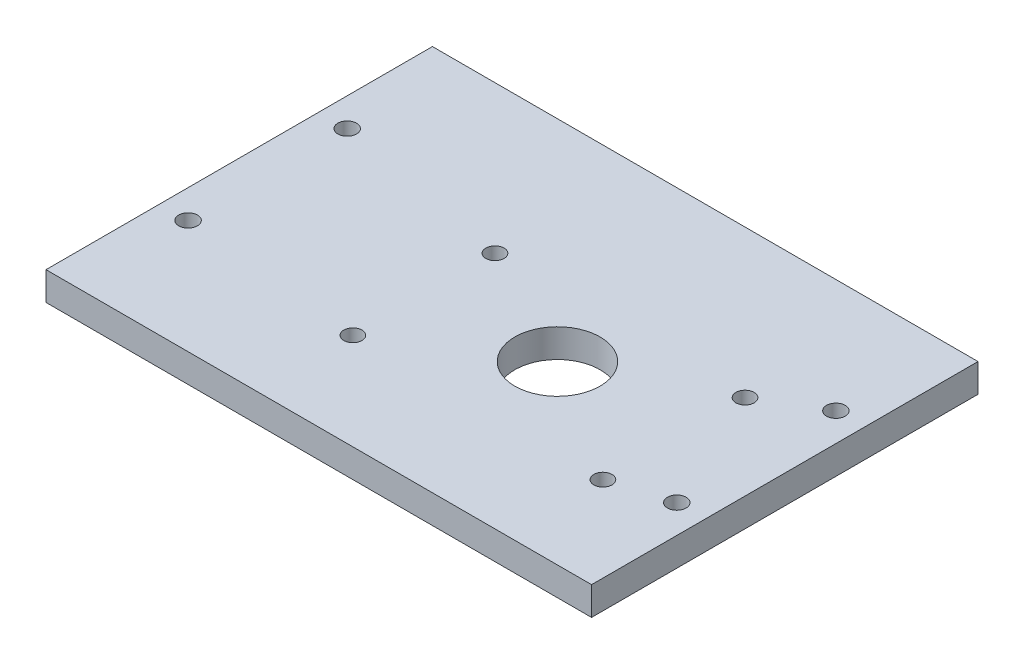
ISO-10303-21;
HEADER;
FILE_DESCRIPTION(('STEP AP214'),'2;1');
FILE_NAME('part.step','',(''),(''),'','','');
FILE_SCHEMA(('AUTOMOTIVE_DESIGN { 1 0 10303 214 1 1 1 1 }'));
ENDSEC;
DATA;
#1=APPLICATION_CONTEXT('core data for automotive mechanical design processes');
#2=APPLICATION_PROTOCOL_DEFINITION('international standard','automotive_design',2000,#1);
#3=PRODUCT_CONTEXT('',#1,'mechanical');
#4=PRODUCT('Part','Part','',(#3));
#5=PRODUCT_RELATED_PRODUCT_CATEGORY('part','',(#4));
#6=PRODUCT_DEFINITION_FORMATION('','',#4);
#7=PRODUCT_DEFINITION_CONTEXT('part definition',#1,'design');
#8=PRODUCT_DEFINITION('design','',#6,#7);
#9=PRODUCT_DEFINITION_SHAPE('','',#8);
#10=(LENGTH_UNIT() NAMED_UNIT(*) SI_UNIT(.MILLI.,.METRE.));
#11=(NAMED_UNIT(*) PLANE_ANGLE_UNIT() SI_UNIT($,.RADIAN.));
#12=(NAMED_UNIT(*) SI_UNIT($,.STERADIAN.) SOLID_ANGLE_UNIT());
#13=UNCERTAINTY_MEASURE_WITH_UNIT(LENGTH_MEASURE(1.E-05),#10,'distance_accuracy_value','');
#14=(GEOMETRIC_REPRESENTATION_CONTEXT(3) GLOBAL_UNCERTAINTY_ASSIGNED_CONTEXT((#13)) GLOBAL_UNIT_ASSIGNED_CONTEXT((#10,
#11,#12)) REPRESENTATION_CONTEXT('',''));
#15=CARTESIAN_POINT('',(0.,0.,0.));
#16=DIRECTION('',(0.,0.,1.));
#17=DIRECTION('',(1.,0.,0.));
#18=AXIS2_PLACEMENT_3D('',#15,#16,#17);
#19=CARTESIAN_POINT('',(-48.,5.,-34.));
#20=DIRECTION('',(1.,0.,0.));
#21=DIRECTION('',(0.,0.,-1.));
#22=AXIS2_PLACEMENT_3D('',#19,#20,#21);
#23=PLANE('',#22);
#24=DIRECTION('',(0.,0.,1.));
#25=VECTOR('',#24,1.);
#26=CARTESIAN_POINT('',(-48.,0.,-34.));
#27=LINE('',#26,#25);
#28=CARTESIAN_POINT('',(-48.,0.,-34.));
#29=VERTEX_POINT('',#28);
#30=CARTESIAN_POINT('',(-48.,0.,34.));
#31=VERTEX_POINT('',#30);
#32=EDGE_CURVE('E95',#29,#31,#27,.T.);
#33=ORIENTED_EDGE('',*,*,#32,.T.);
#34=DIRECTION('',(0.,-1.,0.));
#35=VECTOR('',#34,1.);
#36=CARTESIAN_POINT('',(-48.,5.,34.));
#37=LINE('',#36,#35);
#38=CARTESIAN_POINT('',(-48.,5.,34.));
#39=VERTEX_POINT('',#38);
#40=EDGE_CURVE('E11',#39,#31,#37,.T.);
#41=ORIENTED_EDGE('',*,*,#40,.F.);
#42=DIRECTION('',(0.,0.,1.));
#43=VECTOR('',#42,1.);
#44=CARTESIAN_POINT('',(-48.,5.,-34.));
#45=LINE('',#44,#43);
#46=CARTESIAN_POINT('',(-48.,5.,-34.));
#47=VERTEX_POINT('',#46);
#48=EDGE_CURVE('E83',#47,#39,#45,.T.);
#49=ORIENTED_EDGE('',*,*,#48,.F.);
#50=DIRECTION('',(0.,-1.,0.));
#51=VECTOR('',#50,1.);
#52=CARTESIAN_POINT('',(-48.,5.,-34.));
#53=LINE('',#52,#51);
#54=EDGE_CURVE('E91',#47,#29,#53,.T.);
#55=ORIENTED_EDGE('',*,*,#54,.T.);
#56=EDGE_LOOP('',(#33,#41,#49,#55));
#57=FACE_BOUND('',#56,.T.);
#58=ADVANCED_FACE('F32',(#57),#23,.F.);
#59=CARTESIAN_POINT('',(-48.,5.,34.));
#60=DIRECTION('',(0.,0.,-1.));
#61=DIRECTION('',(-1.,0.,0.));
#62=AXIS2_PLACEMENT_3D('',#59,#60,#61);
#63=PLANE('',#62);
#64=DIRECTION('',(1.,0.,0.));
#65=VECTOR('',#64,1.);
#66=CARTESIAN_POINT('',(-48.,0.,34.));
#67=LINE('',#66,#65);
#68=CARTESIAN_POINT('',(48.,0.,34.));
#69=VERTEX_POINT('',#68);
#70=EDGE_CURVE('E87',#31,#69,#67,.T.);
#71=ORIENTED_EDGE('',*,*,#70,.T.);
#72=DIRECTION('',(0.,-1.,0.));
#73=VECTOR('',#72,1.);
#74=CARTESIAN_POINT('',(48.,5.,34.));
#75=LINE('',#74,#73);
#76=CARTESIAN_POINT('',(48.,5.,34.));
#77=VERTEX_POINT('',#76);
#78=EDGE_CURVE('E40',#77,#69,#75,.T.);
#79=ORIENTED_EDGE('',*,*,#78,.F.);
#80=DIRECTION('',(1.,0.,0.));
#81=VECTOR('',#80,1.);
#82=CARTESIAN_POINT('',(-48.,5.,34.));
#83=LINE('',#82,#81);
#84=EDGE_CURVE('E78',#39,#77,#83,.T.);
#85=ORIENTED_EDGE('',*,*,#84,.F.);
#86=ORIENTED_EDGE('',*,*,#40,.T.);
#87=EDGE_LOOP('',(#71,#79,#85,#86));
#88=FACE_BOUND('',#87,.T.);
#89=ADVANCED_FACE('F86',(#88),#63,.F.);
#90=CARTESIAN_POINT('',(48.,5.,-34.));
#91=DIRECTION('',(-1.,0.,0.));
#92=DIRECTION('',(0.,0.,1.));
#93=AXIS2_PLACEMENT_3D('',#90,#91,#92);
#94=PLANE('',#93);
#95=DIRECTION('',(0.,0.,-1.));
#96=VECTOR('',#95,1.);
#97=CARTESIAN_POINT('',(48.,0.,-34.));
#98=LINE('',#97,#96);
#99=CARTESIAN_POINT('',(48.,0.,-34.));
#100=VERTEX_POINT('',#99);
#101=EDGE_CURVE('E65',#69,#100,#98,.T.);
#102=ORIENTED_EDGE('',*,*,#101,.T.);
#103=DIRECTION('',(0.,-1.,0.));
#104=VECTOR('',#103,1.);
#105=CARTESIAN_POINT('',(48.,5.,-34.));
#106=LINE('',#105,#104);
#107=CARTESIAN_POINT('',(48.,5.,-34.));
#108=VERTEX_POINT('',#107);
#109=EDGE_CURVE('E88',#108,#100,#106,.T.);
#110=ORIENTED_EDGE('',*,*,#109,.F.);
#111=DIRECTION('',(0.,0.,-1.));
#112=VECTOR('',#111,1.);
#113=CARTESIAN_POINT('',(48.,5.,-34.));
#114=LINE('',#113,#112);
#115=EDGE_CURVE('E81',#77,#108,#114,.T.);
#116=ORIENTED_EDGE('',*,*,#115,.F.);
#117=ORIENTED_EDGE('',*,*,#78,.T.);
#118=EDGE_LOOP('',(#102,#110,#116,#117));
#119=FACE_BOUND('',#118,.T.);
#120=ADVANCED_FACE('F89',(#119),#94,.F.);
#121=CARTESIAN_POINT('',(-48.,5.,-34.));
#122=DIRECTION('',(0.,0.,1.));
#123=DIRECTION('',(1.,0.,0.));
#124=AXIS2_PLACEMENT_3D('',#121,#122,#123);
#125=PLANE('',#124);
#126=DIRECTION('',(-1.,0.,0.));
#127=VECTOR('',#126,1.);
#128=CARTESIAN_POINT('',(-48.,0.,-34.));
#129=LINE('',#128,#127);
#130=EDGE_CURVE('E71',#100,#29,#129,.T.);
#131=ORIENTED_EDGE('',*,*,#130,.T.);
#132=ORIENTED_EDGE('',*,*,#54,.F.);
#133=DIRECTION('',(-1.,0.,0.));
#134=VECTOR('',#133,1.);
#135=CARTESIAN_POINT('',(-48.,5.,-34.));
#136=LINE('',#135,#134);
#137=EDGE_CURVE('E48',#108,#47,#136,.T.);
#138=ORIENTED_EDGE('',*,*,#137,.F.);
#139=ORIENTED_EDGE('',*,*,#109,.T.);
#140=EDGE_LOOP('',(#131,#132,#138,#139));
#141=FACE_BOUND('',#140,.T.);
#142=ADVANCED_FACE('F103',(#141),#125,.F.);
#143=CARTESIAN_POINT('',(0.,5.,0.));
#144=DIRECTION('',(0.,1.,0.));
#145=DIRECTION('',(0.,0.,1.));
#146=AXIS2_PLACEMENT_3D('',#143,#144,#145);
#147=PLANE('',#146);
#148=CARTESIAN_POINT('',(-11.,5.,17.));
#149=DIRECTION('',(0.,1.,0.));
#150=DIRECTION('',(0.,0.,1.));
#151=AXIS2_PLACEMENT_3D('',#148,#149,#150);
#152=CIRCLE('',#151,1.6);
#153=CARTESIAN_POINT('',(-11.,5.,18.6));
#154=VERTEX_POINT('',#153);
#155=EDGE_CURVE('E157',#154,#154,#152,.T.);
#156=ORIENTED_EDGE('',*,*,#155,.F.);
#157=EDGE_LOOP('',(#156));
#158=FACE_BOUND('',#157,.T.);
#159=CARTESIAN_POINT('',(33.,5.,17.));
#160=DIRECTION('',(0.,1.,0.));
#161=DIRECTION('',(0.,0.,1.));
#162=AXIS2_PLACEMENT_3D('',#159,#160,#161);
#163=CIRCLE('',#162,1.6);
#164=CARTESIAN_POINT('',(33.,5.,18.6));
#165=VERTEX_POINT('',#164);
#166=EDGE_CURVE('E151',#165,#165,#163,.T.);
#167=ORIENTED_EDGE('',*,*,#166,.F.);
#168=EDGE_LOOP('',(#167));
#169=FACE_BOUND('',#168,.T.);
#170=CARTESIAN_POINT('',(33.,5.,-8.));
#171=DIRECTION('',(0.,1.,0.));
#172=DIRECTION('',(0.,0.,1.));
#173=AXIS2_PLACEMENT_3D('',#170,#171,#172);
#174=CIRCLE('',#173,1.6);
#175=CARTESIAN_POINT('',(33.,5.,-6.4));
#176=VERTEX_POINT('',#175);
#177=EDGE_CURVE('E145',#176,#176,#174,.T.);
#178=ORIENTED_EDGE('',*,*,#177,.F.);
#179=EDGE_LOOP('',(#178));
#180=FACE_BOUND('',#179,.T.);
#181=CARTESIAN_POINT('',(11.,5.,2.99999999999999));
#182=DIRECTION('',(0.,1.,0.));
#183=DIRECTION('',(0.,0.,1.));
#184=AXIS2_PLACEMENT_3D('',#181,#182,#183);
#185=CIRCLE('',#184,7.5);
#186=CARTESIAN_POINT('',(11.,5.,10.5));
#187=VERTEX_POINT('',#186);
#188=EDGE_CURVE('E139',#187,#187,#185,.T.);
#189=ORIENTED_EDGE('',*,*,#188,.F.);
#190=EDGE_LOOP('',(#189));
#191=FACE_BOUND('',#190,.T.);
#192=CARTESIAN_POINT('',(-42.9999999999996,5.,14.));
#193=DIRECTION('',(0.,1.,0.));
#194=DIRECTION('',(0.,0.,1.));
#195=AXIS2_PLACEMENT_3D('',#192,#193,#194);
#196=CIRCLE('',#195,1.65);
#197=CARTESIAN_POINT('',(-42.9999999999996,5.,15.65));
#198=VERTEX_POINT('',#197);
#199=EDGE_CURVE('E133',#198,#198,#196,.T.);
#200=ORIENTED_EDGE('',*,*,#199,.F.);
#201=EDGE_LOOP('',(#200));
#202=FACE_BOUND('',#201,.T.);
#203=CARTESIAN_POINT('',(43.0000000000003,5.,14.));
#204=DIRECTION('',(0.,1.,0.));
#205=DIRECTION('',(0.,0.,1.));
#206=AXIS2_PLACEMENT_3D('',#203,#204,#205);
#207=CIRCLE('',#206,1.65);
#208=CARTESIAN_POINT('',(43.0000000000003,5.,15.65));
#209=VERTEX_POINT('',#208);
#210=EDGE_CURVE('E127',#209,#209,#207,.T.);
#211=ORIENTED_EDGE('',*,*,#210,.F.);
#212=EDGE_LOOP('',(#211));
#213=FACE_BOUND('',#212,.T.);
#214=CARTESIAN_POINT('',(43.,5.,-14.));
#215=DIRECTION('',(0.,1.,0.));
#216=DIRECTION('',(0.,0.,1.));
#217=AXIS2_PLACEMENT_3D('',#214,#215,#216);
#218=CIRCLE('',#217,1.65);
#219=CARTESIAN_POINT('',(43.,5.,-12.35));
#220=VERTEX_POINT('',#219);
#221=EDGE_CURVE('E121',#220,#220,#218,.T.);
#222=ORIENTED_EDGE('',*,*,#221,.F.);
#223=EDGE_LOOP('',(#222));
#224=FACE_BOUND('',#223,.T.);
#225=CARTESIAN_POINT('',(-11.,5.,-8.));
#226=DIRECTION('',(0.,1.,0.));
#227=DIRECTION('',(0.,0.,1.));
#228=AXIS2_PLACEMENT_3D('',#225,#226,#227);
#229=CIRCLE('',#228,1.6);
#230=CARTESIAN_POINT('',(-11.,5.,-6.4));
#231=VERTEX_POINT('',#230);
#232=EDGE_CURVE('E115',#231,#231,#229,.T.);
#233=ORIENTED_EDGE('',*,*,#232,.F.);
#234=EDGE_LOOP('',(#233));
#235=FACE_BOUND('',#234,.T.);
#236=CARTESIAN_POINT('',(-43.,5.,-14.));
#237=DIRECTION('',(0.,1.,0.));
#238=DIRECTION('',(0.,0.,1.));
#239=AXIS2_PLACEMENT_3D('',#236,#237,#238);
#240=CIRCLE('',#239,1.65);
#241=CARTESIAN_POINT('',(-43.,5.,-12.35));
#242=VERTEX_POINT('',#241);
#243=EDGE_CURVE('E109',#242,#242,#240,.T.);
#244=ORIENTED_EDGE('',*,*,#243,.F.);
#245=EDGE_LOOP('',(#244));
#246=FACE_BOUND('',#245,.T.);
#247=ORIENTED_EDGE('',*,*,#48,.T.);
#248=ORIENTED_EDGE('',*,*,#84,.T.);
#249=ORIENTED_EDGE('',*,*,#115,.T.);
#250=ORIENTED_EDGE('',*,*,#137,.T.);
#251=EDGE_LOOP('',(#247,#248,#249,#250));
#252=FACE_BOUND('',#251,.T.);
#253=ADVANCED_FACE('F79',(#158,#169,#180,#191,#202,#213,#224,#235,#246,#252),#147,.T.);
#254=CARTESIAN_POINT('',(0.,0.,0.));
#255=DIRECTION('',(0.,1.,0.));
#256=DIRECTION('',(0.,0.,1.));
#257=AXIS2_PLACEMENT_3D('',#254,#255,#256);
#258=PLANE('',#257);
#259=CARTESIAN_POINT('',(-11.,0.,17.));
#260=DIRECTION('',(0.,1.,0.));
#261=DIRECTION('',(0.,0.,1.));
#262=AXIS2_PLACEMENT_3D('',#259,#260,#261);
#263=CIRCLE('',#262,1.6);
#264=CARTESIAN_POINT('',(-11.,0.,18.6));
#265=VERTEX_POINT('',#264);
#266=EDGE_CURVE('E154',#265,#265,#263,.T.);
#267=ORIENTED_EDGE('',*,*,#266,.T.);
#268=EDGE_LOOP('',(#267));
#269=FACE_BOUND('',#268,.T.);
#270=CARTESIAN_POINT('',(33.,0.,17.));
#271=DIRECTION('',(0.,1.,0.));
#272=DIRECTION('',(0.,0.,1.));
#273=AXIS2_PLACEMENT_3D('',#270,#271,#272);
#274=CIRCLE('',#273,1.6);
#275=CARTESIAN_POINT('',(33.,0.,18.6));
#276=VERTEX_POINT('',#275);
#277=EDGE_CURVE('E148',#276,#276,#274,.T.);
#278=ORIENTED_EDGE('',*,*,#277,.T.);
#279=EDGE_LOOP('',(#278));
#280=FACE_BOUND('',#279,.T.);
#281=CARTESIAN_POINT('',(33.,0.,-8.));
#282=DIRECTION('',(0.,1.,0.));
#283=DIRECTION('',(0.,0.,1.));
#284=AXIS2_PLACEMENT_3D('',#281,#282,#283);
#285=CIRCLE('',#284,1.6);
#286=CARTESIAN_POINT('',(33.,0.,-6.4));
#287=VERTEX_POINT('',#286);
#288=EDGE_CURVE('E142',#287,#287,#285,.T.);
#289=ORIENTED_EDGE('',*,*,#288,.T.);
#290=EDGE_LOOP('',(#289));
#291=FACE_BOUND('',#290,.T.);
#292=CARTESIAN_POINT('',(11.,0.,2.99999999999999));
#293=DIRECTION('',(0.,1.,0.));
#294=DIRECTION('',(0.,0.,1.));
#295=AXIS2_PLACEMENT_3D('',#292,#293,#294);
#296=CIRCLE('',#295,7.5);
#297=CARTESIAN_POINT('',(11.,0.,10.5));
#298=VERTEX_POINT('',#297);
#299=EDGE_CURVE('E136',#298,#298,#296,.T.);
#300=ORIENTED_EDGE('',*,*,#299,.T.);
#301=EDGE_LOOP('',(#300));
#302=FACE_BOUND('',#301,.T.);
#303=CARTESIAN_POINT('',(-42.9999999999996,0.,14.));
#304=DIRECTION('',(0.,1.,0.));
#305=DIRECTION('',(0.,0.,1.));
#306=AXIS2_PLACEMENT_3D('',#303,#304,#305);
#307=CIRCLE('',#306,1.65);
#308=CARTESIAN_POINT('',(-42.9999999999996,0.,15.65));
#309=VERTEX_POINT('',#308);
#310=EDGE_CURVE('E130',#309,#309,#307,.T.);
#311=ORIENTED_EDGE('',*,*,#310,.T.);
#312=EDGE_LOOP('',(#311));
#313=FACE_BOUND('',#312,.T.);
#314=CARTESIAN_POINT('',(43.0000000000003,0.,14.));
#315=DIRECTION('',(0.,1.,0.));
#316=DIRECTION('',(0.,0.,1.));
#317=AXIS2_PLACEMENT_3D('',#314,#315,#316);
#318=CIRCLE('',#317,1.65);
#319=CARTESIAN_POINT('',(43.0000000000003,0.,15.65));
#320=VERTEX_POINT('',#319);
#321=EDGE_CURVE('E124',#320,#320,#318,.T.);
#322=ORIENTED_EDGE('',*,*,#321,.T.);
#323=EDGE_LOOP('',(#322));
#324=FACE_BOUND('',#323,.T.);
#325=CARTESIAN_POINT('',(43.,0.,-14.));
#326=DIRECTION('',(0.,1.,0.));
#327=DIRECTION('',(0.,0.,1.));
#328=AXIS2_PLACEMENT_3D('',#325,#326,#327);
#329=CIRCLE('',#328,1.65);
#330=CARTESIAN_POINT('',(43.,0.,-12.35));
#331=VERTEX_POINT('',#330);
#332=EDGE_CURVE('E118',#331,#331,#329,.T.);
#333=ORIENTED_EDGE('',*,*,#332,.T.);
#334=EDGE_LOOP('',(#333));
#335=FACE_BOUND('',#334,.T.);
#336=CARTESIAN_POINT('',(-11.,0.,-8.));
#337=DIRECTION('',(0.,1.,0.));
#338=DIRECTION('',(0.,0.,1.));
#339=AXIS2_PLACEMENT_3D('',#336,#337,#338);
#340=CIRCLE('',#339,1.6);
#341=CARTESIAN_POINT('',(-11.,0.,-6.4));
#342=VERTEX_POINT('',#341);
#343=EDGE_CURVE('E112',#342,#342,#340,.T.);
#344=ORIENTED_EDGE('',*,*,#343,.T.);
#345=EDGE_LOOP('',(#344));
#346=FACE_BOUND('',#345,.T.);
#347=CARTESIAN_POINT('',(-43.,0.,-14.));
#348=DIRECTION('',(0.,1.,0.));
#349=DIRECTION('',(0.,0.,1.));
#350=AXIS2_PLACEMENT_3D('',#347,#348,#349);
#351=CIRCLE('',#350,1.65);
#352=CARTESIAN_POINT('',(-43.,0.,-12.35));
#353=VERTEX_POINT('',#352);
#354=EDGE_CURVE('E98',#353,#353,#351,.T.);
#355=ORIENTED_EDGE('',*,*,#354,.T.);
#356=EDGE_LOOP('',(#355));
#357=FACE_BOUND('',#356,.T.);
#358=ORIENTED_EDGE('',*,*,#32,.F.);
#359=ORIENTED_EDGE('',*,*,#130,.F.);
#360=ORIENTED_EDGE('',*,*,#101,.F.);
#361=ORIENTED_EDGE('',*,*,#70,.F.);
#362=EDGE_LOOP('',(#358,#359,#360,#361));
#363=FACE_BOUND('',#362,.T.);
#364=ADVANCED_FACE('F106',(#269,#280,#291,#302,#313,#324,#335,#346,#357,#363),#258,.F.);
#365=CARTESIAN_POINT('',(-43.,0.,-14.));
#366=DIRECTION('',(0.,1.,0.));
#367=DIRECTION('',(0.,0.,1.));
#368=AXIS2_PLACEMENT_3D('',#365,#366,#367);
#369=CYLINDRICAL_SURFACE('',#368,1.65);
#370=ORIENTED_EDGE('',*,*,#354,.F.);
#371=EDGE_LOOP('',(#370));
#372=FACE_BOUND('',#371,.T.);
#373=ORIENTED_EDGE('',*,*,#243,.T.);
#374=EDGE_LOOP('',(#373));
#375=FACE_BOUND('',#374,.T.);
#376=ADVANCED_FACE('F191',(#372,#375),#369,.F.);
#377=CARTESIAN_POINT('',(-11.,0.,-8.));
#378=DIRECTION('',(0.,1.,0.));
#379=DIRECTION('',(0.,0.,1.));
#380=AXIS2_PLACEMENT_3D('',#377,#378,#379);
#381=CYLINDRICAL_SURFACE('',#380,1.6);
#382=ORIENTED_EDGE('',*,*,#343,.F.);
#383=EDGE_LOOP('',(#382));
#384=FACE_BOUND('',#383,.T.);
#385=ORIENTED_EDGE('',*,*,#232,.T.);
#386=EDGE_LOOP('',(#385));
#387=FACE_BOUND('',#386,.T.);
#388=ADVANCED_FACE('F193',(#384,#387),#381,.F.);
#389=CARTESIAN_POINT('',(43.,0.,-14.));
#390=DIRECTION('',(0.,1.,0.));
#391=DIRECTION('',(0.,0.,1.));
#392=AXIS2_PLACEMENT_3D('',#389,#390,#391);
#393=CYLINDRICAL_SURFACE('',#392,1.65);
#394=ORIENTED_EDGE('',*,*,#332,.F.);
#395=EDGE_LOOP('',(#394));
#396=FACE_BOUND('',#395,.T.);
#397=ORIENTED_EDGE('',*,*,#221,.T.);
#398=EDGE_LOOP('',(#397));
#399=FACE_BOUND('',#398,.T.);
#400=ADVANCED_FACE('F200',(#396,#399),#393,.F.);
#401=CARTESIAN_POINT('',(43.0000000000003,0.,14.));
#402=DIRECTION('',(0.,1.,0.));
#403=DIRECTION('',(0.,0.,1.));
#404=AXIS2_PLACEMENT_3D('',#401,#402,#403);
#405=CYLINDRICAL_SURFACE('',#404,1.65);
#406=ORIENTED_EDGE('',*,*,#321,.F.);
#407=EDGE_LOOP('',(#406));
#408=FACE_BOUND('',#407,.T.);
#409=ORIENTED_EDGE('',*,*,#210,.T.);
#410=EDGE_LOOP('',(#409));
#411=FACE_BOUND('',#410,.T.);
#412=ADVANCED_FACE('F246',(#408,#411),#405,.F.);
#413=CARTESIAN_POINT('',(-42.9999999999996,0.,14.));
#414=DIRECTION('',(0.,1.,0.));
#415=DIRECTION('',(0.,0.,1.));
#416=AXIS2_PLACEMENT_3D('',#413,#414,#415);
#417=CYLINDRICAL_SURFACE('',#416,1.65);
#418=ORIENTED_EDGE('',*,*,#310,.F.);
#419=EDGE_LOOP('',(#418));
#420=FACE_BOUND('',#419,.T.);
#421=ORIENTED_EDGE('',*,*,#199,.T.);
#422=EDGE_LOOP('',(#421));
#423=FACE_BOUND('',#422,.T.);
#424=ADVANCED_FACE('F256',(#420,#423),#417,.F.);
#425=CARTESIAN_POINT('',(11.,0.,2.99999999999999));
#426=DIRECTION('',(0.,1.,0.));
#427=DIRECTION('',(0.,0.,1.));
#428=AXIS2_PLACEMENT_3D('',#425,#426,#427);
#429=CYLINDRICAL_SURFACE('',#428,7.5);
#430=ORIENTED_EDGE('',*,*,#299,.F.);
#431=EDGE_LOOP('',(#430));
#432=FACE_BOUND('',#431,.T.);
#433=ORIENTED_EDGE('',*,*,#188,.T.);
#434=EDGE_LOOP('',(#433));
#435=FACE_BOUND('',#434,.T.);
#436=ADVANCED_FACE('F266',(#432,#435),#429,.F.);
#437=CARTESIAN_POINT('',(33.,0.,-8.));
#438=DIRECTION('',(0.,1.,0.));
#439=DIRECTION('',(0.,0.,1.));
#440=AXIS2_PLACEMENT_3D('',#437,#438,#439);
#441=CYLINDRICAL_SURFACE('',#440,1.6);
#442=ORIENTED_EDGE('',*,*,#288,.F.);
#443=EDGE_LOOP('',(#442));
#444=FACE_BOUND('',#443,.T.);
#445=ORIENTED_EDGE('',*,*,#177,.T.);
#446=EDGE_LOOP('',(#445));
#447=FACE_BOUND('',#446,.T.);
#448=ADVANCED_FACE('F276',(#444,#447),#441,.F.);
#449=CARTESIAN_POINT('',(33.,0.,17.));
#450=DIRECTION('',(0.,1.,0.));
#451=DIRECTION('',(0.,0.,1.));
#452=AXIS2_PLACEMENT_3D('',#449,#450,#451);
#453=CYLINDRICAL_SURFACE('',#452,1.6);
#454=ORIENTED_EDGE('',*,*,#277,.F.);
#455=EDGE_LOOP('',(#454));
#456=FACE_BOUND('',#455,.T.);
#457=ORIENTED_EDGE('',*,*,#166,.T.);
#458=EDGE_LOOP('',(#457));
#459=FACE_BOUND('',#458,.T.);
#460=ADVANCED_FACE('F168',(#456,#459),#453,.F.);
#461=CARTESIAN_POINT('',(-11.,0.,17.));
#462=DIRECTION('',(0.,1.,0.));
#463=DIRECTION('',(0.,0.,1.));
#464=AXIS2_PLACEMENT_3D('',#461,#462,#463);
#465=CYLINDRICAL_SURFACE('',#464,1.6);
#466=ORIENTED_EDGE('',*,*,#266,.F.);
#467=EDGE_LOOP('',(#466));
#468=FACE_BOUND('',#467,.T.);
#469=ORIENTED_EDGE('',*,*,#155,.T.);
#470=EDGE_LOOP('',(#469));
#471=FACE_BOUND('',#470,.T.);
#472=ADVANCED_FACE('F165',(#468,#471),#465,.F.);
#473=CLOSED_SHELL('',(#58,#89,#120,#142,#253,#364,#376,#388,#400,#412,#424,#436,#448,#460,#472));
#474=MANIFOLD_SOLID_BREP('B2',#473);
#475=ADVANCED_BREP_SHAPE_REPRESENTATION('',(#18,#474),#14);
#476=SHAPE_DEFINITION_REPRESENTATION(#9,#475);
ENDSEC;
END-ISO-10303-21;
